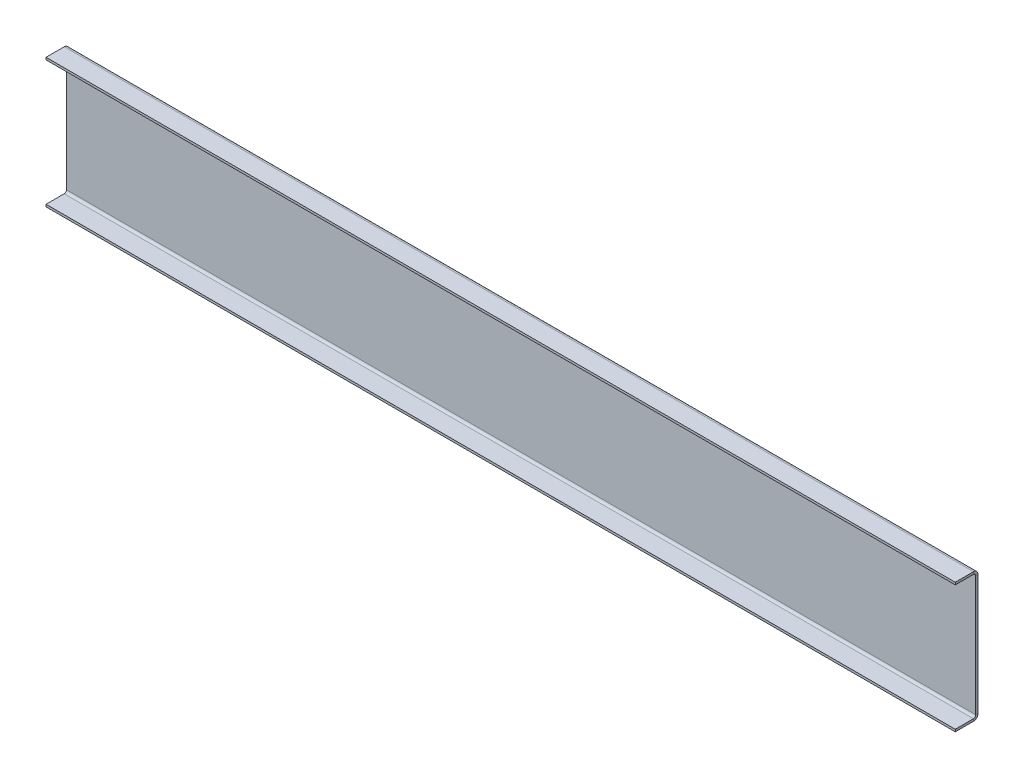
ISO-10303-21;
HEADER;
FILE_DESCRIPTION(('STEP AP214'),'2;1');
FILE_NAME('part.step','',(''),(''),'','','');
FILE_SCHEMA(('AUTOMOTIVE_DESIGN { 1 0 10303 214 1 1 1 1 }'));
ENDSEC;
DATA;
#1=APPLICATION_CONTEXT('core data for automotive mechanical design processes');
#2=APPLICATION_PROTOCOL_DEFINITION('international standard','automotive_design',2000,#1);
#3=PRODUCT_CONTEXT('',#1,'mechanical');
#4=PRODUCT('Part','Part','',(#3));
#5=PRODUCT_RELATED_PRODUCT_CATEGORY('part','',(#4));
#6=PRODUCT_DEFINITION_FORMATION('','',#4);
#7=PRODUCT_DEFINITION_CONTEXT('part definition',#1,'design');
#8=PRODUCT_DEFINITION('design','',#6,#7);
#9=PRODUCT_DEFINITION_SHAPE('','',#8);
#10=(LENGTH_UNIT() NAMED_UNIT(*) SI_UNIT(.MILLI.,.METRE.));
#11=(NAMED_UNIT(*) PLANE_ANGLE_UNIT() SI_UNIT($,.RADIAN.));
#12=(NAMED_UNIT(*) SI_UNIT($,.STERADIAN.) SOLID_ANGLE_UNIT());
#13=UNCERTAINTY_MEASURE_WITH_UNIT(LENGTH_MEASURE(1.E-05),#10,'distance_accuracy_value','');
#14=(GEOMETRIC_REPRESENTATION_CONTEXT(3) GLOBAL_UNCERTAINTY_ASSIGNED_CONTEXT((#13)) GLOBAL_UNIT_ASSIGNED_CONTEXT((#10,
#11,#12)) REPRESENTATION_CONTEXT('',''));
#15=CARTESIAN_POINT('',(0.,0.,0.));
#16=DIRECTION('',(0.,0.,1.));
#17=DIRECTION('',(1.,0.,0.));
#18=AXIS2_PLACEMENT_3D('',#15,#16,#17);
#19=CARTESIAN_POINT('',(0.,0.,-2.));
#20=DIRECTION('',(0.,0.,-1.));
#21=DIRECTION('',(-1.,0.,0.));
#22=AXIS2_PLACEMENT_3D('',#19,#20,#21);
#23=PLANE('',#22);
#24=DIRECTION('',(0.,1.,0.));
#25=VECTOR('',#24,1.);
#26=CARTESIAN_POINT('',(400.,-55.,-2.));
#27=LINE('',#26,#25);
#28=CARTESIAN_POINT('',(400.,-53.,-2.));
#29=VERTEX_POINT('',#28);
#30=CARTESIAN_POINT('',(400.,53.,-2.));
#31=VERTEX_POINT('',#30);
#32=EDGE_CURVE('E26',#29,#31,#27,.T.);
#33=ORIENTED_EDGE('',*,*,#32,.F.);
#34=DIRECTION('',(1.,0.,0.));
#35=VECTOR('',#34,1.);
#36=CARTESIAN_POINT('',(400.,-53.,-2.));
#37=LINE('',#36,#35);
#38=CARTESIAN_POINT('',(-400.,-53.,-2.));
#39=VERTEX_POINT('',#38);
#40=EDGE_CURVE('E112',#29,#39,#37,.F.);
#41=ORIENTED_EDGE('',*,*,#40,.T.);
#42=DIRECTION('',(0.,-1.,0.));
#43=VECTOR('',#42,1.);
#44=CARTESIAN_POINT('',(-400.,-55.,-2.));
#45=LINE('',#44,#43);
#46=CARTESIAN_POINT('',(-400.,53.,-2.));
#47=VERTEX_POINT('',#46);
#48=EDGE_CURVE('E11',#47,#39,#45,.T.);
#49=ORIENTED_EDGE('',*,*,#48,.F.);
#50=DIRECTION('',(-1.,0.,0.));
#51=VECTOR('',#50,1.);
#52=CARTESIAN_POINT('',(-400.,53.,-2.));
#53=LINE('',#52,#51);
#54=EDGE_CURVE('E198',#47,#31,#53,.F.);
#55=ORIENTED_EDGE('',*,*,#54,.T.);
#56=EDGE_LOOP('',(#33,#41,#49,#55));
#57=FACE_BOUND('',#56,.T.);
#58=ADVANCED_FACE('F17',(#57),#23,.T.);
#59=CARTESIAN_POINT('',(0.,0.,0.));
#60=DIRECTION('',(0.,0.,-1.));
#61=DIRECTION('',(-1.,0.,0.));
#62=AXIS2_PLACEMENT_3D('',#59,#60,#61);
#63=PLANE('',#62);
#64=DIRECTION('',(1.,0.,0.));
#65=VECTOR('',#64,1.);
#66=CARTESIAN_POINT('',(400.,-53.,0.));
#67=LINE('',#66,#65);
#68=CARTESIAN_POINT('',(400.,-53.,0.));
#69=VERTEX_POINT('',#68);
#70=CARTESIAN_POINT('',(-400.,-53.,0.));
#71=VERTEX_POINT('',#70);
#72=EDGE_CURVE('E161',#69,#71,#67,.F.);
#73=ORIENTED_EDGE('',*,*,#72,.F.);
#74=DIRECTION('',(0.,1.,0.));
#75=VECTOR('',#74,1.);
#76=CARTESIAN_POINT('',(400.,-55.,0.));
#77=LINE('',#76,#75);
#78=CARTESIAN_POINT('',(400.,53.,0.));
#79=VERTEX_POINT('',#78);
#80=EDGE_CURVE('E215',#69,#79,#77,.T.);
#81=ORIENTED_EDGE('',*,*,#80,.T.);
#82=DIRECTION('',(-1.,0.,0.));
#83=VECTOR('',#82,1.);
#84=CARTESIAN_POINT('',(-400.,53.,0.));
#85=LINE('',#84,#83);
#86=CARTESIAN_POINT('',(-400.,53.,0.));
#87=VERTEX_POINT('',#86);
#88=EDGE_CURVE('E209',#87,#79,#85,.F.);
#89=ORIENTED_EDGE('',*,*,#88,.F.);
#90=DIRECTION('',(0.,-1.,0.));
#91=VECTOR('',#90,1.);
#92=CARTESIAN_POINT('',(-400.,-55.,0.));
#93=LINE('',#92,#91);
#94=EDGE_CURVE('E21',#87,#71,#93,.T.);
#95=ORIENTED_EDGE('',*,*,#94,.T.);
#96=EDGE_LOOP('',(#73,#81,#89,#95));
#97=FACE_BOUND('',#96,.T.);
#98=ADVANCED_FACE('F227',(#97),#63,.F.);
#99=CARTESIAN_POINT('',(400.,-55.,-2.));
#100=DIRECTION('',(1.,0.,0.));
#101=DIRECTION('',(0.,0.,-1.));
#102=AXIS2_PLACEMENT_3D('',#99,#100,#101);
#103=PLANE('',#102);
#104=ORIENTED_EDGE('',*,*,#80,.F.);
#105=DIRECTION('',(0.,0.,-1.));
#106=VECTOR('',#105,1.);
#107=CARTESIAN_POINT('',(400.,-53.,0.));
#108=LINE('',#107,#106);
#109=EDGE_CURVE('E157',#69,#29,#108,.T.);
#110=ORIENTED_EDGE('',*,*,#109,.T.);
#111=ORIENTED_EDGE('',*,*,#32,.T.);
#112=DIRECTION('',(0.,0.,-1.));
#113=VECTOR('',#112,1.);
#114=CARTESIAN_POINT('',(400.,53.,0.));
#115=LINE('',#114,#113);
#116=EDGE_CURVE('E213',#79,#31,#115,.T.);
#117=ORIENTED_EDGE('',*,*,#116,.F.);
#118=EDGE_LOOP('',(#104,#110,#111,#117));
#119=FACE_BOUND('',#118,.T.);
#120=ADVANCED_FACE('F19',(#119),#103,.T.);
#121=CARTESIAN_POINT('',(-400.,-55.,-2.));
#122=DIRECTION('',(-1.,0.,0.));
#123=DIRECTION('',(0.,0.,1.));
#124=AXIS2_PLACEMENT_3D('',#121,#122,#123);
#125=PLANE('',#124);
#126=DIRECTION('',(0.,0.,-1.));
#127=VECTOR('',#126,1.);
#128=CARTESIAN_POINT('',(-400.,-53.,0.));
#129=LINE('',#128,#127);
#130=EDGE_CURVE('E164',#71,#39,#129,.T.);
#131=ORIENTED_EDGE('',*,*,#130,.F.);
#132=ORIENTED_EDGE('',*,*,#94,.F.);
#133=DIRECTION('',(0.,0.,-1.));
#134=VECTOR('',#133,1.);
#135=CARTESIAN_POINT('',(-400.,53.,0.));
#136=LINE('',#135,#134);
#137=EDGE_CURVE('E203',#87,#47,#136,.T.);
#138=ORIENTED_EDGE('',*,*,#137,.T.);
#139=ORIENTED_EDGE('',*,*,#48,.T.);
#140=EDGE_LOOP('',(#131,#132,#138,#139));
#141=FACE_BOUND('',#140,.T.);
#142=ADVANCED_FACE('F230',(#141),#125,.T.);
#143=CARTESIAN_POINT('',(400.,53.,2.));
#144=DIRECTION('',(1.,0.,0.));
#145=DIRECTION('',(0.,0.,-1.));
#146=AXIS2_PLACEMENT_3D('',#143,#144,#145);
#147=PLANE('',#146);
#148=DIRECTION('',(0.,1.,0.));
#149=VECTOR('',#148,1.);
#150=CARTESIAN_POINT('',(400.,55.,2.));
#151=LINE('',#150,#149);
#152=CARTESIAN_POINT('',(400.,55.,2.));
#153=VERTEX_POINT('',#152);
#154=CARTESIAN_POINT('',(400.,57.,1.99999999999997));
#155=VERTEX_POINT('',#154);
#156=EDGE_CURVE('E166',#153,#155,#151,.T.);
#157=ORIENTED_EDGE('',*,*,#156,.F.);
#158=CARTESIAN_POINT('',(400.,53.,2.));
#159=DIRECTION('',(-1.,0.,0.));
#160=DIRECTION('',(0.,0.,1.));
#161=AXIS2_PLACEMENT_3D('',#158,#159,#160);
#162=CIRCLE('',#161,2.);
#163=EDGE_CURVE('E206',#79,#153,#162,.F.);
#164=ORIENTED_EDGE('',*,*,#163,.F.);
#165=ORIENTED_EDGE('',*,*,#116,.T.);
#166=CARTESIAN_POINT('',(400.,53.,2.));
#167=DIRECTION('',(-1.,0.,0.));
#168=DIRECTION('',(0.,0.,1.));
#169=AXIS2_PLACEMENT_3D('',#166,#167,#168);
#170=CIRCLE('',#169,4.);
#171=EDGE_CURVE('E34',#31,#155,#170,.F.);
#172=ORIENTED_EDGE('',*,*,#171,.T.);
#173=EDGE_LOOP('',(#157,#164,#165,#172));
#174=FACE_BOUND('',#173,.T.);
#175=ADVANCED_FACE('F274',(#174),#147,.T.);
#176=CARTESIAN_POINT('',(-400.,53.,2.));
#177=DIRECTION('',(1.,0.,0.));
#178=DIRECTION('',(0.,0.,-1.));
#179=AXIS2_PLACEMENT_3D('',#176,#177,#178);
#180=PLANE('',#179);
#181=CARTESIAN_POINT('',(-400.,53.,2.));
#182=DIRECTION('',(-1.,0.,0.));
#183=DIRECTION('',(0.,0.,1.));
#184=AXIS2_PLACEMENT_3D('',#181,#182,#183);
#185=CIRCLE('',#184,2.);
#186=CARTESIAN_POINT('',(-400.,55.,2.));
#187=VERTEX_POINT('',#186);
#188=EDGE_CURVE('E197',#187,#87,#185,.T.);
#189=ORIENTED_EDGE('',*,*,#188,.F.);
#190=DIRECTION('',(0.,1.,0.));
#191=VECTOR('',#190,1.);
#192=CARTESIAN_POINT('',(-400.,55.,1.99999999999996));
#193=LINE('',#192,#191);
#194=CARTESIAN_POINT('',(-400.,57.,1.99999999999996));
#195=VERTEX_POINT('',#194);
#196=EDGE_CURVE('E170',#187,#195,#193,.T.);
#197=ORIENTED_EDGE('',*,*,#196,.T.);
#198=CARTESIAN_POINT('',(-400.,53.,2.));
#199=DIRECTION('',(-1.,0.,0.));
#200=DIRECTION('',(0.,0.,1.));
#201=AXIS2_PLACEMENT_3D('',#198,#199,#200);
#202=CIRCLE('',#201,4.);
#203=EDGE_CURVE('E201',#195,#47,#202,.T.);
#204=ORIENTED_EDGE('',*,*,#203,.T.);
#205=ORIENTED_EDGE('',*,*,#137,.F.);
#206=EDGE_LOOP('',(#189,#197,#204,#205));
#207=FACE_BOUND('',#206,.T.);
#208=ADVANCED_FACE('F271',(#207),#180,.F.);
#209=CARTESIAN_POINT('',(-400.,53.,2.));
#210=DIRECTION('',(-1.,0.,0.));
#211=DIRECTION('',(0.,1.,0.));
#212=AXIS2_PLACEMENT_3D('',#209,#210,#211);
#213=CYLINDRICAL_SURFACE('',#212,4.);
#214=ORIENTED_EDGE('',*,*,#54,.F.);
#215=ORIENTED_EDGE('',*,*,#203,.F.);
#216=DIRECTION('',(1.,0.,0.));
#217=VECTOR('',#216,1.);
#218=CARTESIAN_POINT('',(0.,57.,1.99999999999997));
#219=LINE('',#218,#217);
#220=EDGE_CURVE('E173',#195,#155,#219,.T.);
#221=ORIENTED_EDGE('',*,*,#220,.T.);
#222=ORIENTED_EDGE('',*,*,#171,.F.);
#223=EDGE_LOOP('',(#214,#215,#221,#222));
#224=FACE_BOUND('',#223,.T.);
#225=ADVANCED_FACE('F423',(#224),#213,.T.);
#226=CARTESIAN_POINT('',(-400.,53.,2.));
#227=DIRECTION('',(-1.,0.,0.));
#228=DIRECTION('',(0.,1.,0.));
#229=AXIS2_PLACEMENT_3D('',#226,#227,#228);
#230=CYLINDRICAL_SURFACE('',#229,2.);
#231=ORIENTED_EDGE('',*,*,#88,.T.);
#232=ORIENTED_EDGE('',*,*,#163,.T.);
#233=DIRECTION('',(-1.,0.,0.));
#234=VECTOR('',#233,1.);
#235=CARTESIAN_POINT('',(400.,55.,2.));
#236=LINE('',#235,#234);
#237=EDGE_CURVE('E168',#153,#187,#236,.T.);
#238=ORIENTED_EDGE('',*,*,#237,.T.);
#239=ORIENTED_EDGE('',*,*,#188,.T.);
#240=EDGE_LOOP('',(#231,#232,#238,#239));
#241=FACE_BOUND('',#240,.T.);
#242=ADVANCED_FACE('F413',(#241),#230,.F.);
#243=CARTESIAN_POINT('',(400.,57.,0.));
#244=DIRECTION('',(-1.,0.,0.));
#245=DIRECTION('',(0.,0.,1.));
#246=AXIS2_PLACEMENT_3D('',#243,#244,#245);
#247=PLANE('',#246);
#248=ORIENTED_EDGE('',*,*,#156,.T.);
#249=DIRECTION('',(0.,0.,-1.));
#250=VECTOR('',#249,1.);
#251=CARTESIAN_POINT('',(400.,57.,0.));
#252=LINE('',#251,#250);
#253=CARTESIAN_POINT('',(400.,57.,18.));
#254=VERTEX_POINT('',#253);
#255=EDGE_CURVE('E178',#254,#155,#252,.T.);
#256=ORIENTED_EDGE('',*,*,#255,.F.);
#257=DIRECTION('',(0.,-1.,0.));
#258=VECTOR('',#257,1.);
#259=CARTESIAN_POINT('',(400.,57.,18.));
#260=LINE('',#259,#258);
#261=CARTESIAN_POINT('',(400.,55.,18.));
#262=VERTEX_POINT('',#261);
#263=EDGE_CURVE('E186',#254,#262,#260,.T.);
#264=ORIENTED_EDGE('',*,*,#263,.T.);
#265=DIRECTION('',(0.,0.,-1.));
#266=VECTOR('',#265,1.);
#267=CARTESIAN_POINT('',(400.,55.,0.));
#268=LINE('',#267,#266);
#269=EDGE_CURVE('E177',#262,#153,#268,.T.);
#270=ORIENTED_EDGE('',*,*,#269,.T.);
#271=EDGE_LOOP('',(#248,#256,#264,#270));
#272=FACE_BOUND('',#271,.T.);
#273=ADVANCED_FACE('F403',(#272),#247,.F.);
#274=CARTESIAN_POINT('',(-400.,57.,18.));
#275=DIRECTION('',(1.,0.,0.));
#276=DIRECTION('',(0.,0.,-1.));
#277=AXIS2_PLACEMENT_3D('',#274,#275,#276);
#278=PLANE('',#277);
#279=ORIENTED_EDGE('',*,*,#196,.F.);
#280=DIRECTION('',(0.,0.,1.));
#281=VECTOR('',#280,1.);
#282=CARTESIAN_POINT('',(-400.,55.,18.));
#283=LINE('',#282,#281);
#284=CARTESIAN_POINT('',(-400.,55.,18.));
#285=VERTEX_POINT('',#284);
#286=EDGE_CURVE('E189',#187,#285,#283,.T.);
#287=ORIENTED_EDGE('',*,*,#286,.T.);
#288=DIRECTION('',(0.,-1.,0.));
#289=VECTOR('',#288,1.);
#290=CARTESIAN_POINT('',(-400.,57.,18.));
#291=LINE('',#290,#289);
#292=CARTESIAN_POINT('',(-400.,57.,18.));
#293=VERTEX_POINT('',#292);
#294=EDGE_CURVE('E194',#293,#285,#291,.T.);
#295=ORIENTED_EDGE('',*,*,#294,.F.);
#296=DIRECTION('',(0.,0.,1.));
#297=VECTOR('',#296,1.);
#298=CARTESIAN_POINT('',(-400.,57.,18.));
#299=LINE('',#298,#297);
#300=EDGE_CURVE('E181',#195,#293,#299,.T.);
#301=ORIENTED_EDGE('',*,*,#300,.F.);
#302=EDGE_LOOP('',(#279,#287,#295,#301));
#303=FACE_BOUND('',#302,.T.);
#304=ADVANCED_FACE('F393',(#303),#278,.F.);
#305=CARTESIAN_POINT('',(0.,57.,-1.97802545035135E-13));
#306=DIRECTION('',(0.,-1.,0.));
#307=DIRECTION('',(0.,0.,-1.));
#308=AXIS2_PLACEMENT_3D('',#305,#306,#307);
#309=PLANE('',#308);
#310=ORIENTED_EDGE('',*,*,#220,.F.);
#311=ORIENTED_EDGE('',*,*,#300,.T.);
#312=DIRECTION('',(1.,0.,0.));
#313=VECTOR('',#312,1.);
#314=CARTESIAN_POINT('',(400.,57.,18.));
#315=LINE('',#314,#313);
#316=EDGE_CURVE('E184',#293,#254,#315,.T.);
#317=ORIENTED_EDGE('',*,*,#316,.T.);
#318=ORIENTED_EDGE('',*,*,#255,.T.);
#319=EDGE_LOOP('',(#310,#311,#317,#318));
#320=FACE_BOUND('',#319,.T.);
#321=ADVANCED_FACE('F383',(#320),#309,.F.);
#322=CARTESIAN_POINT('',(0.,55.,-1.90819582357448E-13));
#323=DIRECTION('',(0.,-1.,0.));
#324=DIRECTION('',(0.,0.,-1.));
#325=AXIS2_PLACEMENT_3D('',#322,#323,#324);
#326=PLANE('',#325);
#327=ORIENTED_EDGE('',*,*,#286,.F.);
#328=ORIENTED_EDGE('',*,*,#237,.F.);
#329=ORIENTED_EDGE('',*,*,#269,.F.);
#330=DIRECTION('',(1.,0.,0.));
#331=VECTOR('',#330,1.);
#332=CARTESIAN_POINT('',(400.,55.,18.));
#333=LINE('',#332,#331);
#334=EDGE_CURVE('E182',#285,#262,#333,.T.);
#335=ORIENTED_EDGE('',*,*,#334,.F.);
#336=EDGE_LOOP('',(#327,#328,#329,#335));
#337=FACE_BOUND('',#336,.T.);
#338=ADVANCED_FACE('F373',(#337),#326,.T.);
#339=CARTESIAN_POINT('',(400.,57.,18.));
#340=DIRECTION('',(0.,0.,-1.));
#341=DIRECTION('',(0.,1.,0.));
#342=AXIS2_PLACEMENT_3D('',#339,#340,#341);
#343=PLANE('',#342);
#344=ORIENTED_EDGE('',*,*,#334,.T.);
#345=ORIENTED_EDGE('',*,*,#263,.F.);
#346=ORIENTED_EDGE('',*,*,#316,.F.);
#347=ORIENTED_EDGE('',*,*,#294,.T.);
#348=EDGE_LOOP('',(#344,#345,#346,#347));
#349=FACE_BOUND('',#348,.T.);
#350=ADVANCED_FACE('F364',(#349),#343,.F.);
#351=CARTESIAN_POINT('',(-400.,-53.,2.00000000000003));
#352=DIRECTION('',(-1.,0.,0.));
#353=DIRECTION('',(0.,0.,1.));
#354=AXIS2_PLACEMENT_3D('',#351,#352,#353);
#355=PLANE('',#354);
#356=DIRECTION('',(0.,-1.,0.));
#357=VECTOR('',#356,1.);
#358=CARTESIAN_POINT('',(-400.,-55.,2.));
#359=LINE('',#358,#357);
#360=CARTESIAN_POINT('',(-400.,-55.,2.));
#361=VERTEX_POINT('',#360);
#362=CARTESIAN_POINT('',(-400.,-57.,2.));
#363=VERTEX_POINT('',#362);
#364=EDGE_CURVE('E244',#361,#363,#359,.T.);
#365=ORIENTED_EDGE('',*,*,#364,.F.);
#366=CARTESIAN_POINT('',(-400.,-53.,2.00000000000003));
#367=DIRECTION('',(1.,0.,0.));
#368=DIRECTION('',(0.,0.,-1.));
#369=AXIS2_PLACEMENT_3D('',#366,#367,#368);
#370=CIRCLE('',#369,2.);
#371=EDGE_CURVE('E115',#71,#361,#370,.F.);
#372=ORIENTED_EDGE('',*,*,#371,.F.);
#373=ORIENTED_EDGE('',*,*,#130,.T.);
#374=CARTESIAN_POINT('',(-400.,-53.,2.00000000000003));
#375=DIRECTION('',(1.,0.,0.));
#376=DIRECTION('',(0.,0.,-1.));
#377=AXIS2_PLACEMENT_3D('',#374,#375,#376);
#378=CIRCLE('',#377,4.);
#379=EDGE_CURVE('E42',#39,#363,#378,.F.);
#380=ORIENTED_EDGE('',*,*,#379,.T.);
#381=EDGE_LOOP('',(#365,#372,#373,#380));
#382=FACE_BOUND('',#381,.T.);
#383=ADVANCED_FACE('F234',(#382),#355,.T.);
#384=CARTESIAN_POINT('',(400.,-53.,2.00000000000003));
#385=DIRECTION('',(-1.,0.,0.));
#386=DIRECTION('',(0.,0.,1.));
#387=AXIS2_PLACEMENT_3D('',#384,#385,#386);
#388=PLANE('',#387);
#389=CARTESIAN_POINT('',(400.,-53.,2.00000000000003));
#390=DIRECTION('',(1.,0.,0.));
#391=DIRECTION('',(0.,0.,-1.));
#392=AXIS2_PLACEMENT_3D('',#389,#390,#391);
#393=CIRCLE('',#392,2.);
#394=CARTESIAN_POINT('',(400.,-55.,2.));
#395=VERTEX_POINT('',#394);
#396=EDGE_CURVE('E122',#395,#69,#393,.T.);
#397=ORIENTED_EDGE('',*,*,#396,.F.);
#398=DIRECTION('',(0.,-1.,0.));
#399=VECTOR('',#398,1.);
#400=CARTESIAN_POINT('',(400.,-55.,2.00000000000004));
#401=LINE('',#400,#399);
#402=CARTESIAN_POINT('',(400.,-57.,2.00000000000003));
#403=VERTEX_POINT('',#402);
#404=EDGE_CURVE('E119',#395,#403,#401,.T.);
#405=ORIENTED_EDGE('',*,*,#404,.T.);
#406=CARTESIAN_POINT('',(400.,-53.,2.00000000000003));
#407=DIRECTION('',(1.,0.,0.));
#408=DIRECTION('',(0.,0.,-1.));
#409=AXIS2_PLACEMENT_3D('',#406,#407,#408);
#410=CIRCLE('',#409,4.);
#411=EDGE_CURVE('E106',#403,#29,#410,.T.);
#412=ORIENTED_EDGE('',*,*,#411,.T.);
#413=ORIENTED_EDGE('',*,*,#109,.F.);
#414=EDGE_LOOP('',(#397,#405,#412,#413));
#415=FACE_BOUND('',#414,.T.);
#416=ADVANCED_FACE('F120',(#415),#388,.F.);
#417=CARTESIAN_POINT('',(400.,-53.,2.00000000000003));
#418=DIRECTION('',(1.,0.,0.));
#419=DIRECTION('',(0.,-1.,0.));
#420=AXIS2_PLACEMENT_3D('',#417,#418,#419);
#421=CYLINDRICAL_SURFACE('',#420,4.);
#422=ORIENTED_EDGE('',*,*,#40,.F.);
#423=ORIENTED_EDGE('',*,*,#411,.F.);
#424=DIRECTION('',(-1.,0.,0.));
#425=VECTOR('',#424,1.);
#426=CARTESIAN_POINT('',(0.,-57.,2.));
#427=LINE('',#426,#425);
#428=EDGE_CURVE('E110',#403,#363,#427,.T.);
#429=ORIENTED_EDGE('',*,*,#428,.T.);
#430=ORIENTED_EDGE('',*,*,#379,.F.);
#431=EDGE_LOOP('',(#422,#423,#429,#430));
#432=FACE_BOUND('',#431,.T.);
#433=ADVANCED_FACE('F108',(#432),#421,.T.);
#434=CARTESIAN_POINT('',(400.,-53.,2.00000000000003));
#435=DIRECTION('',(1.,0.,0.));
#436=DIRECTION('',(0.,-1.,0.));
#437=AXIS2_PLACEMENT_3D('',#434,#435,#436);
#438=CYLINDRICAL_SURFACE('',#437,2.);
#439=ORIENTED_EDGE('',*,*,#72,.T.);
#440=ORIENTED_EDGE('',*,*,#371,.T.);
#441=DIRECTION('',(1.,0.,0.));
#442=VECTOR('',#441,1.);
#443=CARTESIAN_POINT('',(-400.,-55.,2.));
#444=LINE('',#443,#442);
#445=EDGE_CURVE('E126',#361,#395,#444,.T.);
#446=ORIENTED_EDGE('',*,*,#445,.T.);
#447=ORIENTED_EDGE('',*,*,#396,.T.);
#448=EDGE_LOOP('',(#439,#440,#446,#447));
#449=FACE_BOUND('',#448,.T.);
#450=ADVANCED_FACE('F240',(#449),#438,.F.);
#451=CARTESIAN_POINT('',(-400.,-57.,0.));
#452=DIRECTION('',(1.,0.,0.));
#453=DIRECTION('',(0.,0.,-1.));
#454=AXIS2_PLACEMENT_3D('',#451,#452,#453);
#455=PLANE('',#454);
#456=ORIENTED_EDGE('',*,*,#364,.T.);
#457=DIRECTION('',(0.,0.,-1.));
#458=VECTOR('',#457,1.);
#459=CARTESIAN_POINT('',(-400.,-57.,0.));
#460=LINE('',#459,#458);
#461=CARTESIAN_POINT('',(-400.,-57.,18.));
#462=VERTEX_POINT('',#461);
#463=EDGE_CURVE('E134',#462,#363,#460,.T.);
#464=ORIENTED_EDGE('',*,*,#463,.F.);
#465=DIRECTION('',(0.,1.,0.));
#466=VECTOR('',#465,1.);
#467=CARTESIAN_POINT('',(-400.,-57.,18.));
#468=LINE('',#467,#466);
#469=CARTESIAN_POINT('',(-400.,-55.,18.));
#470=VERTEX_POINT('',#469);
#471=EDGE_CURVE('E143',#462,#470,#468,.T.);
#472=ORIENTED_EDGE('',*,*,#471,.T.);
#473=DIRECTION('',(0.,0.,-1.));
#474=VECTOR('',#473,1.);
#475=CARTESIAN_POINT('',(-400.,-55.,0.));
#476=LINE('',#475,#474);
#477=EDGE_CURVE('E135',#470,#361,#476,.T.);
#478=ORIENTED_EDGE('',*,*,#477,.T.);
#479=EDGE_LOOP('',(#456,#464,#472,#478));
#480=FACE_BOUND('',#479,.T.);
#481=ADVANCED_FACE('F248',(#480),#455,.F.);
#482=CARTESIAN_POINT('',(400.,-57.,18.));
#483=DIRECTION('',(-1.,0.,0.));
#484=DIRECTION('',(0.,0.,1.));
#485=AXIS2_PLACEMENT_3D('',#482,#483,#484);
#486=PLANE('',#485);
#487=ORIENTED_EDGE('',*,*,#404,.F.);
#488=DIRECTION('',(0.,0.,1.));
#489=VECTOR('',#488,1.);
#490=CARTESIAN_POINT('',(400.,-55.,18.));
#491=LINE('',#490,#489);
#492=CARTESIAN_POINT('',(400.,-55.,18.));
#493=VERTEX_POINT('',#492);
#494=EDGE_CURVE('E150',#395,#493,#491,.T.);
#495=ORIENTED_EDGE('',*,*,#494,.T.);
#496=DIRECTION('',(0.,1.,0.));
#497=VECTOR('',#496,1.);
#498=CARTESIAN_POINT('',(400.,-57.,18.));
#499=LINE('',#498,#497);
#500=CARTESIAN_POINT('',(400.,-57.,18.));
#501=VERTEX_POINT('',#500);
#502=EDGE_CURVE('E139',#501,#493,#499,.T.);
#503=ORIENTED_EDGE('',*,*,#502,.F.);
#504=DIRECTION('',(0.,0.,1.));
#505=VECTOR('',#504,1.);
#506=CARTESIAN_POINT('',(400.,-57.,18.));
#507=LINE('',#506,#505);
#508=EDGE_CURVE('E131',#403,#501,#507,.T.);
#509=ORIENTED_EDGE('',*,*,#508,.F.);
#510=EDGE_LOOP('',(#487,#495,#503,#509));
#511=FACE_BOUND('',#510,.T.);
#512=ADVANCED_FACE('F137',(#511),#486,.F.);
#513=CARTESIAN_POINT('',(0.,-57.,-1.97802545035135E-13));
#514=DIRECTION('',(0.,1.,0.));
#515=DIRECTION('',(0.,0.,1.));
#516=AXIS2_PLACEMENT_3D('',#513,#514,#515);
#517=PLANE('',#516);
#518=ORIENTED_EDGE('',*,*,#428,.F.);
#519=ORIENTED_EDGE('',*,*,#508,.T.);
#520=DIRECTION('',(-1.,0.,0.));
#521=VECTOR('',#520,1.);
#522=CARTESIAN_POINT('',(-400.,-57.,18.));
#523=LINE('',#522,#521);
#524=EDGE_CURVE('E141',#501,#462,#523,.T.);
#525=ORIENTED_EDGE('',*,*,#524,.T.);
#526=ORIENTED_EDGE('',*,*,#463,.T.);
#527=EDGE_LOOP('',(#518,#519,#525,#526));
#528=FACE_BOUND('',#527,.T.);
#529=ADVANCED_FACE('F130',(#528),#517,.F.);
#530=CARTESIAN_POINT('',(0.,-55.,-1.90819582357448E-13));
#531=DIRECTION('',(0.,1.,0.));
#532=DIRECTION('',(0.,0.,1.));
#533=AXIS2_PLACEMENT_3D('',#530,#531,#532);
#534=PLANE('',#533);
#535=ORIENTED_EDGE('',*,*,#494,.F.);
#536=ORIENTED_EDGE('',*,*,#445,.F.);
#537=ORIENTED_EDGE('',*,*,#477,.F.);
#538=DIRECTION('',(-1.,0.,0.));
#539=VECTOR('',#538,1.);
#540=CARTESIAN_POINT('',(-400.,-55.,18.));
#541=LINE('',#540,#539);
#542=EDGE_CURVE('E145',#493,#470,#541,.T.);
#543=ORIENTED_EDGE('',*,*,#542,.F.);
#544=EDGE_LOOP('',(#535,#536,#537,#543));
#545=FACE_BOUND('',#544,.T.);
#546=ADVANCED_FACE('F251',(#545),#534,.T.);
#547=CARTESIAN_POINT('',(-400.,-57.,18.));
#548=DIRECTION('',(0.,0.,-1.));
#549=DIRECTION('',(0.,1.,0.));
#550=AXIS2_PLACEMENT_3D('',#547,#548,#549);
#551=PLANE('',#550);
#552=ORIENTED_EDGE('',*,*,#542,.T.);
#553=ORIENTED_EDGE('',*,*,#471,.F.);
#554=ORIENTED_EDGE('',*,*,#524,.F.);
#555=ORIENTED_EDGE('',*,*,#502,.T.);
#556=EDGE_LOOP('',(#552,#553,#554,#555));
#557=FACE_BOUND('',#556,.T.);
#558=ADVANCED_FACE('F253',(#557),#551,.F.);
#559=CLOSED_SHELL('',(#58,#98,#120,#142,#175,#208,#225,#242,#273,#304,#321,#338,#350,#383,#416,
#433,#450,#481,#512,#529,#546,#558));
#560=MANIFOLD_SOLID_BREP('B1',#559);
#561=ADVANCED_BREP_SHAPE_REPRESENTATION('',(#18,#560),#14);
#562=SHAPE_DEFINITION_REPRESENTATION(#9,#561);
ENDSEC;
END-ISO-10303-21;
